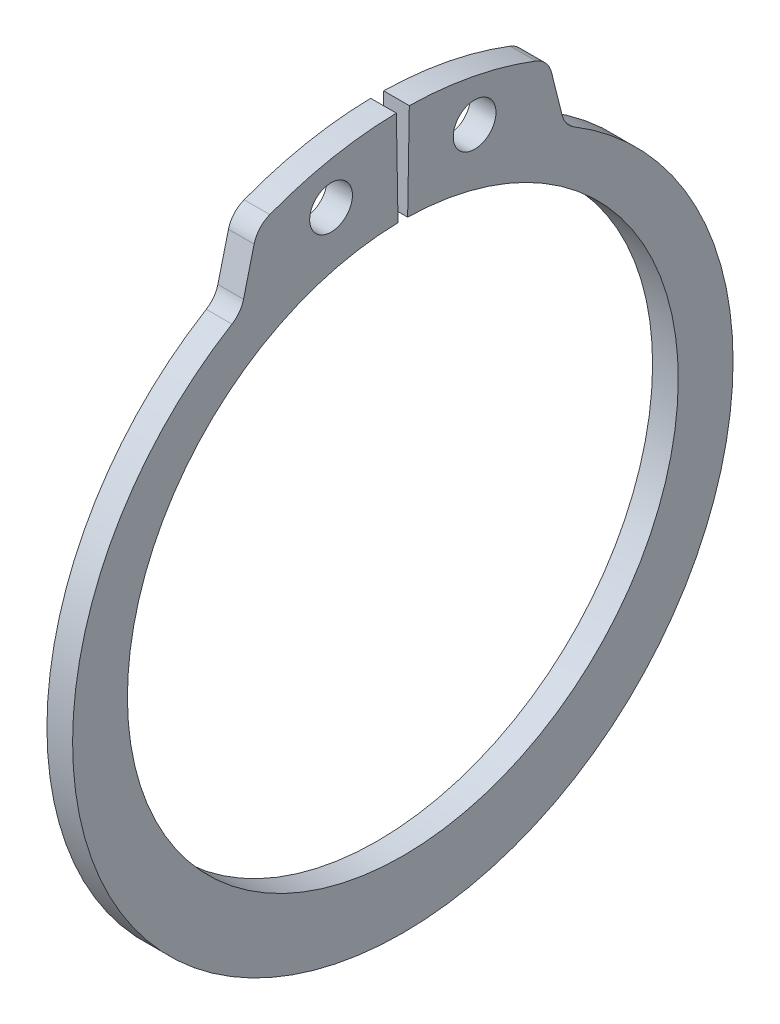
ISO-10303-21;
HEADER;
FILE_DESCRIPTION(('STEP AP214'),'2;1');
FILE_NAME('part.step','',(''),(''),'','','');
FILE_SCHEMA(('AUTOMOTIVE_DESIGN { 1 0 10303 214 1 1 1 1 }'));
ENDSEC;
DATA;
#1=APPLICATION_CONTEXT('core data for automotive mechanical design processes');
#2=APPLICATION_PROTOCOL_DEFINITION('international standard','automotive_design',2000,#1);
#3=PRODUCT_CONTEXT('',#1,'mechanical');
#4=PRODUCT('Part','Part','',(#3));
#5=PRODUCT_RELATED_PRODUCT_CATEGORY('part','',(#4));
#6=PRODUCT_DEFINITION_FORMATION('','',#4);
#7=PRODUCT_DEFINITION_CONTEXT('part definition',#1,'design');
#8=PRODUCT_DEFINITION('design','',#6,#7);
#9=PRODUCT_DEFINITION_SHAPE('','',#8);
#10=(LENGTH_UNIT() NAMED_UNIT(*) SI_UNIT(.MILLI.,.METRE.));
#11=(NAMED_UNIT(*) PLANE_ANGLE_UNIT() SI_UNIT($,.RADIAN.));
#12=(NAMED_UNIT(*) SI_UNIT($,.STERADIAN.) SOLID_ANGLE_UNIT());
#13=UNCERTAINTY_MEASURE_WITH_UNIT(LENGTH_MEASURE(1.E-05),#10,'distance_accuracy_value','');
#14=(GEOMETRIC_REPRESENTATION_CONTEXT(3) GLOBAL_UNCERTAINTY_ASSIGNED_CONTEXT((#13)) GLOBAL_UNIT_ASSIGNED_CONTEXT((#10,
#11,#12)) REPRESENTATION_CONTEXT('',''));
#15=CARTESIAN_POINT('',(0.,0.,0.));
#16=DIRECTION('',(0.,0.,1.));
#17=DIRECTION('',(1.,0.,0.));
#18=AXIS2_PLACEMENT_3D('',#15,#16,#17);
#19=CARTESIAN_POINT('',(0.75,0.,0.));
#20=DIRECTION('',(1.,0.,0.));
#21=DIRECTION('',(0.,0.,-1.));
#22=AXIS2_PLACEMENT_3D('',#19,#20,#21);
#23=PLANE('',#22);
#24=CARTESIAN_POINT('',(0.75,18.8296497348882,4.19530179021566));
#25=DIRECTION('',(1.,0.,0.));
#26=DIRECTION('',(0.,0.,-1.));
#27=AXIS2_PLACEMENT_3D('',#24,#25,#26);
#28=CIRCLE('',#27,1.25);
#29=CARTESIAN_POINT('',(0.75,18.8296497348882,2.94530179021565));
#30=VERTEX_POINT('',#29);
#31=EDGE_CURVE('E218',#30,#30,#28,.T.);
#32=ORIENTED_EDGE('',*,*,#31,.F.);
#33=EDGE_LOOP('',(#32));
#34=FACE_BOUND('',#33,.T.);
#35=CARTESIAN_POINT('',(0.75,0.,0.));
#36=DIRECTION('',(1.,0.,0.));
#37=DIRECTION('',(0.,0.,-1.));
#38=AXIS2_PLACEMENT_3D('',#35,#36,#37);
#39=CIRCLE('',#38,21.7);
#40=CARTESIAN_POINT('',(0.75,21.6966949848937,0.378717219689053));
#41=VERTEX_POINT('',#40);
#42=CARTESIAN_POINT('',(0.75,20.259284870821,7.77504832929812));
#43=VERTEX_POINT('',#42);
#44=EDGE_CURVE('E135',#41,#43,#39,.T.);
#45=ORIENTED_EDGE('',*,*,#44,.T.);
#46=CARTESIAN_POINT('',(0.75,18.8588734742205,7.23760259224987));
#47=DIRECTION('',(1.,0.,0.));
#48=DIRECTION('',(0.,0.,-1.));
#49=AXIS2_PLACEMENT_3D('',#46,#47,#48);
#50=CIRCLE('',#49,1.5);
#51=CARTESIAN_POINT('',(0.75,19.22175631762,8.69304618166387));
#52=VERTEX_POINT('',#51);
#53=EDGE_CURVE('E172',#43,#52,#50,.T.);
#54=ORIENTED_EDGE('',*,*,#53,.T.);
#55=DIRECTION('',(0.,-0.970295726275997,0.241921895599665));
#56=VECTOR('',#55,1.);
#57=CARTESIAN_POINT('',(0.75,19.9624001527376,8.50838293343589));
#58=LINE('',#57,#56);
#59=CARTESIAN_POINT('',(0.75,16.7416947420946,9.31139498121772));
#60=VERTEX_POINT('',#59);
#61=EDGE_CURVE('E210',#52,#60,#58,.T.);
#62=ORIENTED_EDGE('',*,*,#61,.T.);
#63=CARTESIAN_POINT('',(0.75,17.1045775854941,10.7668385706317));
#64=DIRECTION('',(1.,0.,0.));
#65=DIRECTION('',(0.,0.,-1.));
#66=AXIS2_PLACEMENT_3D('',#63,#64,#65);
#67=CIRCLE('',#66,1.5);
#68=CARTESIAN_POINT('',(0.75,15.8210924419831,9.99052298635771));
#69=VERTEX_POINT('',#68);
#70=EDGE_CURVE('E183',#60,#69,#67,.F.);
#71=ORIENTED_EDGE('',*,*,#70,.T.);
#72=CARTESIAN_POINT('',(0.75,-0.696272517122042,0.));
#73=DIRECTION('',(1.,0.,0.));
#74=DIRECTION('',(0.,0.,-1.));
#75=AXIS2_PLACEMENT_3D('',#72,#73,#74);
#76=CIRCLE('',#75,19.303727482878);
#77=CARTESIAN_POINT('',(0.75,15.8210924419831,-9.99052298635771));
#78=VERTEX_POINT('',#77);
#79=EDGE_CURVE('E205',#69,#78,#76,.T.);
#80=ORIENTED_EDGE('',*,*,#79,.T.);
#81=CARTESIAN_POINT('',(0.75,17.1045775854941,-10.7668385706317));
#82=DIRECTION('',(1.,0.,0.));
#83=DIRECTION('',(0.,0.,-1.));
#84=AXIS2_PLACEMENT_3D('',#81,#82,#83);
#85=CIRCLE('',#84,1.5);
#86=CARTESIAN_POINT('',(0.75,16.7416947420946,-9.31139498121773));
#87=VERTEX_POINT('',#86);
#88=EDGE_CURVE('E11',#78,#87,#85,.F.);
#89=ORIENTED_EDGE('',*,*,#88,.T.);
#90=DIRECTION('',(0.,0.970295726275997,0.241921895599665));
#91=VECTOR('',#90,1.);
#92=CARTESIAN_POINT('',(0.75,19.9624001527376,-8.5083829334359));
#93=LINE('',#92,#91);
#94=CARTESIAN_POINT('',(0.75,19.22175631762,-8.69304618166387));
#95=VERTEX_POINT('',#94);
#96=EDGE_CURVE('E204',#87,#95,#93,.T.);
#97=ORIENTED_EDGE('',*,*,#96,.T.);
#98=CARTESIAN_POINT('',(0.75,18.8588734742205,-7.23760259224987));
#99=DIRECTION('',(1.,0.,0.));
#100=DIRECTION('',(0.,0.,-1.));
#101=AXIS2_PLACEMENT_3D('',#98,#99,#100);
#102=CIRCLE('',#101,1.5);
#103=CARTESIAN_POINT('',(0.75,20.259284870821,-7.77504832929813));
#104=VERTEX_POINT('',#103);
#105=EDGE_CURVE('E50',#95,#104,#102,.T.);
#106=ORIENTED_EDGE('',*,*,#105,.T.);
#107=CARTESIAN_POINT('',(0.75,0.,0.));
#108=DIRECTION('',(1.,0.,0.));
#109=DIRECTION('',(0.,0.,1.));
#110=AXIS2_PLACEMENT_3D('',#107,#108,#109);
#111=CIRCLE('',#110,21.7);
#112=CARTESIAN_POINT('',(0.75,21.6966949848937,-0.378717219689056));
#113=VERTEX_POINT('',#112);
#114=EDGE_CURVE('E207',#104,#113,#111,.T.);
#115=ORIENTED_EDGE('',*,*,#114,.T.);
#116=DIRECTION('',(0.,-0.999847695156391,0.0174524064372841));
#117=VECTOR('',#116,1.);
#118=CARTESIAN_POINT('',(0.75,21.6966949848937,-0.378717219689056));
#119=LINE('',#118,#117);
#120=CARTESIAN_POINT('',(0.75,16.0975478920179,-0.280983743640265));
#121=VERTEX_POINT('',#120);
#122=EDGE_CURVE('E141',#113,#121,#119,.T.);
#123=ORIENTED_EDGE('',*,*,#122,.T.);
#124=CARTESIAN_POINT('',(0.75,0.,0.));
#125=DIRECTION('',(-1.,0.,0.));
#126=DIRECTION('',(0.,0.,-1.));
#127=AXIS2_PLACEMENT_3D('',#124,#125,#126);
#128=CIRCLE('',#127,16.1);
#129=CARTESIAN_POINT('',(0.75,16.0975478920179,0.280983743640265));
#130=VERTEX_POINT('',#129);
#131=EDGE_CURVE('E136',#121,#130,#128,.T.);
#132=ORIENTED_EDGE('',*,*,#131,.T.);
#133=DIRECTION('',(0.,0.999847695156391,0.0174524064372835));
#134=VECTOR('',#133,1.);
#135=CARTESIAN_POINT('',(0.75,16.0975478920179,0.280983743640265));
#136=LINE('',#135,#134);
#137=EDGE_CURVE('E125',#130,#41,#136,.T.);
#138=ORIENTED_EDGE('',*,*,#137,.T.);
#139=EDGE_LOOP('',(#45,#54,#62,#71,#80,#89,#97,#106,#115,#123,#132,#138));
#140=FACE_BOUND('',#139,.T.);
#141=CARTESIAN_POINT('',(0.75,18.8296497348882,-4.19530179021566));
#142=DIRECTION('',(1.,0.,0.));
#143=DIRECTION('',(0.,0.,-1.));
#144=AXIS2_PLACEMENT_3D('',#141,#142,#143);
#145=CIRCLE('',#144,1.25);
#146=CARTESIAN_POINT('',(0.75,18.8296497348882,-5.44530179021566));
#147=VERTEX_POINT('',#146);
#148=EDGE_CURVE('E247',#147,#147,#145,.T.);
#149=ORIENTED_EDGE('',*,*,#148,.F.);
#150=EDGE_LOOP('',(#149));
#151=FACE_BOUND('',#150,.T.);
#152=ADVANCED_FACE('F35',(#34,#140,#151),#23,.T.);
#153=CARTESIAN_POINT('',(-0.75,0.,0.));
#154=DIRECTION('',(1.,0.,0.));
#155=DIRECTION('',(0.,0.,-1.));
#156=AXIS2_PLACEMENT_3D('',#153,#154,#155);
#157=PLANE('',#156);
#158=DIRECTION('',(0.,-0.970295726275997,0.241921895599665));
#159=VECTOR('',#158,1.);
#160=CARTESIAN_POINT('',(-0.75,19.9624001527376,8.50838293343589));
#161=LINE('',#160,#159);
#162=CARTESIAN_POINT('',(-0.75,19.22175631762,8.69304618166387));
#163=VERTEX_POINT('',#162);
#164=CARTESIAN_POINT('',(-0.75,16.7416947420946,9.31139498121772));
#165=VERTEX_POINT('',#164);
#166=EDGE_CURVE('E201',#163,#165,#161,.T.);
#167=ORIENTED_EDGE('',*,*,#166,.F.);
#168=CARTESIAN_POINT('',(-0.75,18.8588734742205,7.23760259224987));
#169=DIRECTION('',(1.,0.,0.));
#170=DIRECTION('',(0.,0.,-1.));
#171=AXIS2_PLACEMENT_3D('',#168,#169,#170);
#172=CIRCLE('',#171,1.5);
#173=CARTESIAN_POINT('',(-0.75,20.259284870821,7.77504832929812));
#174=VERTEX_POINT('',#173);
#175=EDGE_CURVE('E167',#163,#174,#172,.F.);
#176=ORIENTED_EDGE('',*,*,#175,.T.);
#177=CARTESIAN_POINT('',(-0.75,0.,0.));
#178=DIRECTION('',(1.,0.,0.));
#179=DIRECTION('',(0.,0.,-1.));
#180=AXIS2_PLACEMENT_3D('',#177,#178,#179);
#181=CIRCLE('',#180,21.7);
#182=CARTESIAN_POINT('',(-0.75,21.6966949848937,0.378717219689053));
#183=VERTEX_POINT('',#182);
#184=EDGE_CURVE('E220',#183,#174,#181,.T.);
#185=ORIENTED_EDGE('',*,*,#184,.F.);
#186=DIRECTION('',(0.,0.999847695156391,0.0174524064372835));
#187=VECTOR('',#186,1.);
#188=CARTESIAN_POINT('',(-0.75,16.0975478920179,0.280983743640265));
#189=LINE('',#188,#187);
#190=CARTESIAN_POINT('',(-0.75,16.0975478920179,0.280983743640265));
#191=VERTEX_POINT('',#190);
#192=EDGE_CURVE('E217',#191,#183,#189,.T.);
#193=ORIENTED_EDGE('',*,*,#192,.F.);
#194=CARTESIAN_POINT('',(-0.75,0.,0.));
#195=DIRECTION('',(-1.,0.,0.));
#196=DIRECTION('',(0.,0.,-1.));
#197=AXIS2_PLACEMENT_3D('',#194,#195,#196);
#198=CIRCLE('',#197,16.1);
#199=CARTESIAN_POINT('',(-0.75,16.0975478920179,-0.280983743640265));
#200=VERTEX_POINT('',#199);
#201=EDGE_CURVE('E149',#200,#191,#198,.T.);
#202=ORIENTED_EDGE('',*,*,#201,.F.);
#203=DIRECTION('',(0.,-0.999847695156391,0.0174524064372841));
#204=VECTOR('',#203,1.);
#205=CARTESIAN_POINT('',(-0.75,21.6966949848937,-0.378717219689056));
#206=LINE('',#205,#204);
#207=CARTESIAN_POINT('',(-0.75,21.6966949848937,-0.378717219689056));
#208=VERTEX_POINT('',#207);
#209=EDGE_CURVE('E145',#208,#200,#206,.T.);
#210=ORIENTED_EDGE('',*,*,#209,.F.);
#211=CARTESIAN_POINT('',(-0.75,0.,0.));
#212=DIRECTION('',(1.,0.,0.));
#213=DIRECTION('',(0.,0.,1.));
#214=AXIS2_PLACEMENT_3D('',#211,#212,#213);
#215=CIRCLE('',#214,21.7);
#216=CARTESIAN_POINT('',(-0.75,20.259284870821,-7.77504832929813));
#217=VERTEX_POINT('',#216);
#218=EDGE_CURVE('E226',#217,#208,#215,.T.);
#219=ORIENTED_EDGE('',*,*,#218,.F.);
#220=CARTESIAN_POINT('',(-0.75,18.8588734742205,-7.23760259224987));
#221=DIRECTION('',(1.,0.,0.));
#222=DIRECTION('',(0.,0.,-1.));
#223=AXIS2_PLACEMENT_3D('',#220,#221,#222);
#224=CIRCLE('',#223,1.5);
#225=CARTESIAN_POINT('',(-0.75,19.22175631762,-8.69304618166387));
#226=VERTEX_POINT('',#225);
#227=EDGE_CURVE('E165',#217,#226,#224,.F.);
#228=ORIENTED_EDGE('',*,*,#227,.T.);
#229=DIRECTION('',(0.,0.970295726275997,0.241921895599665));
#230=VECTOR('',#229,1.);
#231=CARTESIAN_POINT('',(-0.75,19.9624001527376,-8.5083829334359));
#232=LINE('',#231,#230);
#233=CARTESIAN_POINT('',(-0.75,16.7416947420946,-9.31139498121773));
#234=VERTEX_POINT('',#233);
#235=EDGE_CURVE('E192',#234,#226,#232,.T.);
#236=ORIENTED_EDGE('',*,*,#235,.F.);
#237=CARTESIAN_POINT('',(-0.75,17.1045775854941,-10.7668385706317));
#238=DIRECTION('',(1.,0.,0.));
#239=DIRECTION('',(0.,0.,-1.));
#240=AXIS2_PLACEMENT_3D('',#237,#238,#239);
#241=CIRCLE('',#240,1.5);
#242=CARTESIAN_POINT('',(-0.75,15.8210924419831,-9.99052298635771));
#243=VERTEX_POINT('',#242);
#244=EDGE_CURVE('E43',#234,#243,#241,.T.);
#245=ORIENTED_EDGE('',*,*,#244,.T.);
#246=CARTESIAN_POINT('',(-0.75,-0.696272517122042,0.));
#247=DIRECTION('',(1.,0.,0.));
#248=DIRECTION('',(0.,0.,-1.));
#249=AXIS2_PLACEMENT_3D('',#246,#247,#248);
#250=CIRCLE('',#249,19.303727482878);
#251=CARTESIAN_POINT('',(-0.75,15.8210924419831,9.99052298635771));
#252=VERTEX_POINT('',#251);
#253=EDGE_CURVE('E191',#252,#243,#250,.T.);
#254=ORIENTED_EDGE('',*,*,#253,.F.);
#255=CARTESIAN_POINT('',(-0.75,17.1045775854941,10.7668385706317));
#256=DIRECTION('',(1.,0.,0.));
#257=DIRECTION('',(0.,0.,-1.));
#258=AXIS2_PLACEMENT_3D('',#255,#256,#257);
#259=CIRCLE('',#258,1.5);
#260=EDGE_CURVE('E181',#252,#165,#259,.T.);
#261=ORIENTED_EDGE('',*,*,#260,.T.);
#262=EDGE_LOOP('',(#167,#176,#185,#193,#202,#210,#219,#228,#236,#245,#254,#261));
#263=FACE_BOUND('',#262,.T.);
#264=CARTESIAN_POINT('',(-0.75,18.8296497348882,4.19530179021566));
#265=DIRECTION('',(1.,0.,0.));
#266=DIRECTION('',(0.,0.,-1.));
#267=AXIS2_PLACEMENT_3D('',#264,#265,#266);
#268=CIRCLE('',#267,1.25);
#269=CARTESIAN_POINT('',(-0.75,18.8296497348882,2.94530179021565));
#270=VERTEX_POINT('',#269);
#271=EDGE_CURVE('E244',#270,#270,#268,.T.);
#272=ORIENTED_EDGE('',*,*,#271,.T.);
#273=EDGE_LOOP('',(#272));
#274=FACE_BOUND('',#273,.T.);
#275=CARTESIAN_POINT('',(-0.75,18.8296497348882,-4.19530179021566));
#276=DIRECTION('',(1.,0.,0.));
#277=DIRECTION('',(0.,0.,-1.));
#278=AXIS2_PLACEMENT_3D('',#275,#276,#277);
#279=CIRCLE('',#278,1.25);
#280=CARTESIAN_POINT('',(-0.75,18.8296497348882,-5.44530179021566));
#281=VERTEX_POINT('',#280);
#282=EDGE_CURVE('E250',#281,#281,#279,.T.);
#283=ORIENTED_EDGE('',*,*,#282,.T.);
#284=EDGE_LOOP('',(#283));
#285=FACE_BOUND('',#284,.T.);
#286=ADVANCED_FACE('F189',(#263,#274,#285),#157,.F.);
#287=CARTESIAN_POINT('',(0.75,0.,0.));
#288=DIRECTION('',(-1.,0.,0.));
#289=DIRECTION('',(0.,0.,1.));
#290=AXIS2_PLACEMENT_3D('',#287,#288,#289);
#291=CYLINDRICAL_SURFACE('',#290,16.1);
#292=ORIENTED_EDGE('',*,*,#201,.T.);
#293=DIRECTION('',(-1.,0.,0.));
#294=VECTOR('',#293,1.);
#295=CARTESIAN_POINT('',(0.75,16.0975478920179,0.280983743640265));
#296=LINE('',#295,#294);
#297=EDGE_CURVE('E129',#130,#191,#296,.T.);
#298=ORIENTED_EDGE('',*,*,#297,.F.);
#299=ORIENTED_EDGE('',*,*,#131,.F.);
#300=DIRECTION('',(-1.,0.,0.));
#301=VECTOR('',#300,1.);
#302=CARTESIAN_POINT('',(0.75,16.0975478920179,-0.280983743640265));
#303=LINE('',#302,#301);
#304=EDGE_CURVE('E215',#121,#200,#303,.T.);
#305=ORIENTED_EDGE('',*,*,#304,.T.);
#306=EDGE_LOOP('',(#292,#298,#299,#305));
#307=FACE_BOUND('',#306,.T.);
#308=ADVANCED_FACE('F147',(#307),#291,.F.);
#309=CARTESIAN_POINT('',(0.75,16.0975478920179,0.280983743640265));
#310=DIRECTION('',(0.,-0.0174524064372835,0.999847695156391));
#311=DIRECTION('',(0.,-0.999847695156391,-0.0174524064372835));
#312=AXIS2_PLACEMENT_3D('',#309,#310,#311);
#313=PLANE('',#312);
#314=ORIENTED_EDGE('',*,*,#192,.T.);
#315=DIRECTION('',(-1.,0.,0.));
#316=VECTOR('',#315,1.);
#317=CARTESIAN_POINT('',(0.75,21.6966949848937,0.378717219689053));
#318=LINE('',#317,#316);
#319=EDGE_CURVE('E132',#41,#183,#318,.T.);
#320=ORIENTED_EDGE('',*,*,#319,.F.);
#321=ORIENTED_EDGE('',*,*,#137,.F.);
#322=ORIENTED_EDGE('',*,*,#297,.T.);
#323=EDGE_LOOP('',(#314,#320,#321,#322));
#324=FACE_BOUND('',#323,.T.);
#325=ADVANCED_FACE('F127',(#324),#313,.F.);
#326=CARTESIAN_POINT('',(0.75,0.,0.));
#327=DIRECTION('',(-1.,0.,0.));
#328=DIRECTION('',(0.,0.,1.));
#329=AXIS2_PLACEMENT_3D('',#326,#327,#328);
#330=CYLINDRICAL_SURFACE('',#329,21.7);
#331=ORIENTED_EDGE('',*,*,#184,.T.);
#332=DIRECTION('',(-1.,0.,0.));
#333=VECTOR('',#332,1.);
#334=CARTESIAN_POINT('',(0.75,20.259284870821,7.77504832929812));
#335=LINE('',#334,#333);
#336=EDGE_CURVE('E169',#174,#43,#335,.F.);
#337=ORIENTED_EDGE('',*,*,#336,.T.);
#338=ORIENTED_EDGE('',*,*,#44,.F.);
#339=ORIENTED_EDGE('',*,*,#319,.T.);
#340=EDGE_LOOP('',(#331,#337,#338,#339));
#341=FACE_BOUND('',#340,.T.);
#342=ADVANCED_FACE('F238',(#341),#330,.T.);
#343=CARTESIAN_POINT('',(0.75,19.9624001527376,8.50838293343589));
#344=DIRECTION('',(0.,-0.241921895599665,-0.970295726275997));
#345=DIRECTION('',(0.,0.970295726275997,-0.241921895599665));
#346=AXIS2_PLACEMENT_3D('',#343,#344,#345);
#347=PLANE('',#346);
#348=ORIENTED_EDGE('',*,*,#166,.T.);
#349=DIRECTION('',(1.,0.,0.));
#350=VECTOR('',#349,1.);
#351=CARTESIAN_POINT('',(0.75,16.7416947420946,9.31139498121772));
#352=LINE('',#351,#350);
#353=EDGE_CURVE('E163',#165,#60,#352,.T.);
#354=ORIENTED_EDGE('',*,*,#353,.T.);
#355=ORIENTED_EDGE('',*,*,#61,.F.);
#356=DIRECTION('',(-1.,0.,0.));
#357=VECTOR('',#356,1.);
#358=CARTESIAN_POINT('',(0.75,19.22175631762,8.69304618166387));
#359=LINE('',#358,#357);
#360=EDGE_CURVE('E160',#52,#163,#359,.T.);
#361=ORIENTED_EDGE('',*,*,#360,.T.);
#362=EDGE_LOOP('',(#348,#354,#355,#361));
#363=FACE_BOUND('',#362,.T.);
#364=ADVANCED_FACE('F279',(#363),#347,.F.);
#365=CARTESIAN_POINT('',(0.75,-0.696272517122042,0.));
#366=DIRECTION('',(-1.,0.,0.));
#367=DIRECTION('',(0.,0.,1.));
#368=AXIS2_PLACEMENT_3D('',#365,#366,#367);
#369=CYLINDRICAL_SURFACE('',#368,19.303727482878);
#370=ORIENTED_EDGE('',*,*,#79,.F.);
#371=DIRECTION('',(-1.,0.,0.));
#372=VECTOR('',#371,1.);
#373=CARTESIAN_POINT('',(0.75,15.8210924419831,9.99052298635771));
#374=LINE('',#373,#372);
#375=EDGE_CURVE('E152',#69,#252,#374,.T.);
#376=ORIENTED_EDGE('',*,*,#375,.T.);
#377=ORIENTED_EDGE('',*,*,#253,.T.);
#378=DIRECTION('',(-1.,0.,0.));
#379=VECTOR('',#378,1.);
#380=CARTESIAN_POINT('',(0.75,15.8210924419831,-9.99052298635772));
#381=LINE('',#380,#379);
#382=EDGE_CURVE('E150',#243,#78,#381,.F.);
#383=ORIENTED_EDGE('',*,*,#382,.T.);
#384=EDGE_LOOP('',(#370,#376,#377,#383));
#385=FACE_BOUND('',#384,.T.);
#386=ADVANCED_FACE('F198',(#385),#369,.T.);
#387=CARTESIAN_POINT('',(0.75,19.9624001527376,-8.5083829334359));
#388=DIRECTION('',(0.,-0.241921895599665,0.970295726275997));
#389=DIRECTION('',(0.,-0.970295726275997,-0.241921895599666));
#390=AXIS2_PLACEMENT_3D('',#387,#388,#389);
#391=PLANE('',#390);
#392=ORIENTED_EDGE('',*,*,#235,.T.);
#393=DIRECTION('',(-1.,0.,0.));
#394=VECTOR('',#393,1.);
#395=CARTESIAN_POINT('',(0.75,19.22175631762,-8.69304618166387));
#396=LINE('',#395,#394);
#397=EDGE_CURVE('E58',#226,#95,#396,.F.);
#398=ORIENTED_EDGE('',*,*,#397,.T.);
#399=ORIENTED_EDGE('',*,*,#96,.F.);
#400=DIRECTION('',(1.,0.,0.));
#401=VECTOR('',#400,1.);
#402=CARTESIAN_POINT('',(-0.75,16.7416947420946,-9.31139498121773));
#403=LINE('',#402,#401);
#404=EDGE_CURVE('E177',#87,#234,#403,.F.);
#405=ORIENTED_EDGE('',*,*,#404,.T.);
#406=EDGE_LOOP('',(#392,#398,#399,#405));
#407=FACE_BOUND('',#406,.T.);
#408=ADVANCED_FACE('F206',(#407),#391,.F.);
#409=CARTESIAN_POINT('',(0.75,0.,0.));
#410=DIRECTION('',(-1.,0.,0.));
#411=DIRECTION('',(0.,0.,1.));
#412=AXIS2_PLACEMENT_3D('',#409,#410,#411);
#413=CYLINDRICAL_SURFACE('',#412,21.7);
#414=ORIENTED_EDGE('',*,*,#114,.F.);
#415=DIRECTION('',(-1.,0.,0.));
#416=VECTOR('',#415,1.);
#417=CARTESIAN_POINT('',(0.75,20.259284870821,-7.77504832929813));
#418=LINE('',#417,#416);
#419=EDGE_CURVE('E174',#104,#217,#418,.T.);
#420=ORIENTED_EDGE('',*,*,#419,.T.);
#421=ORIENTED_EDGE('',*,*,#218,.T.);
#422=DIRECTION('',(-1.,0.,0.));
#423=VECTOR('',#422,1.);
#424=CARTESIAN_POINT('',(0.75,21.6966949848937,-0.378717219689056));
#425=LINE('',#424,#423);
#426=EDGE_CURVE('E154',#113,#208,#425,.T.);
#427=ORIENTED_EDGE('',*,*,#426,.F.);
#428=EDGE_LOOP('',(#414,#420,#421,#427));
#429=FACE_BOUND('',#428,.T.);
#430=ADVANCED_FACE('F272',(#429),#413,.T.);
#431=CARTESIAN_POINT('',(0.75,21.6966949848937,-0.378717219689056));
#432=DIRECTION('',(0.,-0.0174524064372841,-0.999847695156391));
#433=DIRECTION('',(0.,0.999847695156391,-0.0174524064372841));
#434=AXIS2_PLACEMENT_3D('',#431,#432,#433);
#435=PLANE('',#434);
#436=ORIENTED_EDGE('',*,*,#209,.T.);
#437=ORIENTED_EDGE('',*,*,#304,.F.);
#438=ORIENTED_EDGE('',*,*,#122,.F.);
#439=ORIENTED_EDGE('',*,*,#426,.T.);
#440=EDGE_LOOP('',(#436,#437,#438,#439));
#441=FACE_BOUND('',#440,.T.);
#442=ADVANCED_FACE('F233',(#441),#435,.F.);
#443=CARTESIAN_POINT('',(0.75,18.8296497348882,4.19530179021566));
#444=DIRECTION('',(-1.,0.,0.));
#445=DIRECTION('',(0.,0.,1.));
#446=AXIS2_PLACEMENT_3D('',#443,#444,#445);
#447=CYLINDRICAL_SURFACE('',#446,1.25);
#448=ORIENTED_EDGE('',*,*,#31,.T.);
#449=EDGE_LOOP('',(#448));
#450=FACE_BOUND('',#449,.T.);
#451=ORIENTED_EDGE('',*,*,#271,.F.);
#452=EDGE_LOOP('',(#451));
#453=FACE_BOUND('',#452,.T.);
#454=ADVANCED_FACE('F267',(#450,#453),#447,.F.);
#455=CARTESIAN_POINT('',(0.75,18.8296497348882,-4.19530179021566));
#456=DIRECTION('',(-1.,0.,0.));
#457=DIRECTION('',(0.,0.,1.));
#458=AXIS2_PLACEMENT_3D('',#455,#456,#457);
#459=CYLINDRICAL_SURFACE('',#458,1.25);
#460=ORIENTED_EDGE('',*,*,#148,.T.);
#461=EDGE_LOOP('',(#460));
#462=FACE_BOUND('',#461,.T.);
#463=ORIENTED_EDGE('',*,*,#282,.F.);
#464=EDGE_LOOP('',(#463));
#465=FACE_BOUND('',#464,.T.);
#466=ADVANCED_FACE('F256',(#462,#465),#459,.F.);
#467=CARTESIAN_POINT('',(0.75,17.1045775854941,10.7668385706317));
#468=DIRECTION('',(-1.,0.,0.));
#469=DIRECTION('',(0.,0.,1.));
#470=AXIS2_PLACEMENT_3D('',#467,#468,#469);
#471=CYLINDRICAL_SURFACE('',#470,1.5);
#472=ORIENTED_EDGE('',*,*,#70,.F.);
#473=ORIENTED_EDGE('',*,*,#353,.F.);
#474=ORIENTED_EDGE('',*,*,#260,.F.);
#475=ORIENTED_EDGE('',*,*,#375,.F.);
#476=EDGE_LOOP('',(#472,#473,#474,#475));
#477=FACE_BOUND('',#476,.T.);
#478=ADVANCED_FACE('F289',(#477),#471,.F.);
#479=CARTESIAN_POINT('',(0.75,18.8588734742205,7.23760259224987));
#480=DIRECTION('',(-1.,0.,0.));
#481=DIRECTION('',(0.,0.,1.));
#482=AXIS2_PLACEMENT_3D('',#479,#480,#481);
#483=CYLINDRICAL_SURFACE('',#482,1.5);
#484=ORIENTED_EDGE('',*,*,#53,.F.);
#485=ORIENTED_EDGE('',*,*,#336,.F.);
#486=ORIENTED_EDGE('',*,*,#175,.F.);
#487=ORIENTED_EDGE('',*,*,#360,.F.);
#488=EDGE_LOOP('',(#484,#485,#486,#487));
#489=FACE_BOUND('',#488,.T.);
#490=ADVANCED_FACE('F292',(#489),#483,.T.);
#491=CARTESIAN_POINT('',(0.75,18.8588734742205,-7.23760259224987));
#492=DIRECTION('',(-1.,0.,0.));
#493=DIRECTION('',(0.,0.,1.));
#494=AXIS2_PLACEMENT_3D('',#491,#492,#493);
#495=CYLINDRICAL_SURFACE('',#494,1.5);
#496=ORIENTED_EDGE('',*,*,#105,.F.);
#497=ORIENTED_EDGE('',*,*,#397,.F.);
#498=ORIENTED_EDGE('',*,*,#227,.F.);
#499=ORIENTED_EDGE('',*,*,#419,.F.);
#500=EDGE_LOOP('',(#496,#497,#498,#499));
#501=FACE_BOUND('',#500,.T.);
#502=ADVANCED_FACE('F295',(#501),#495,.T.);
#503=CARTESIAN_POINT('',(0.75,17.1045775854941,-10.7668385706317));
#504=DIRECTION('',(-1.,0.,0.));
#505=DIRECTION('',(0.,0.,1.));
#506=AXIS2_PLACEMENT_3D('',#503,#504,#505);
#507=CYLINDRICAL_SURFACE('',#506,1.5);
#508=ORIENTED_EDGE('',*,*,#88,.F.);
#509=ORIENTED_EDGE('',*,*,#382,.F.);
#510=ORIENTED_EDGE('',*,*,#244,.F.);
#511=ORIENTED_EDGE('',*,*,#404,.F.);
#512=EDGE_LOOP('',(#508,#509,#510,#511));
#513=FACE_BOUND('',#512,.T.);
#514=ADVANCED_FACE('F37',(#513),#507,.F.);
#515=CLOSED_SHELL('',(#152,#286,#308,#325,#342,#364,#386,#408,#430,#442,#454,#466,#478,#490,
#502,#514));
#516=MANIFOLD_SOLID_BREP('B2',#515);
#517=ADVANCED_BREP_SHAPE_REPRESENTATION('',(#18,#516),#14);
#518=SHAPE_DEFINITION_REPRESENTATION(#9,#517);
ENDSEC;
END-ISO-10303-21;
